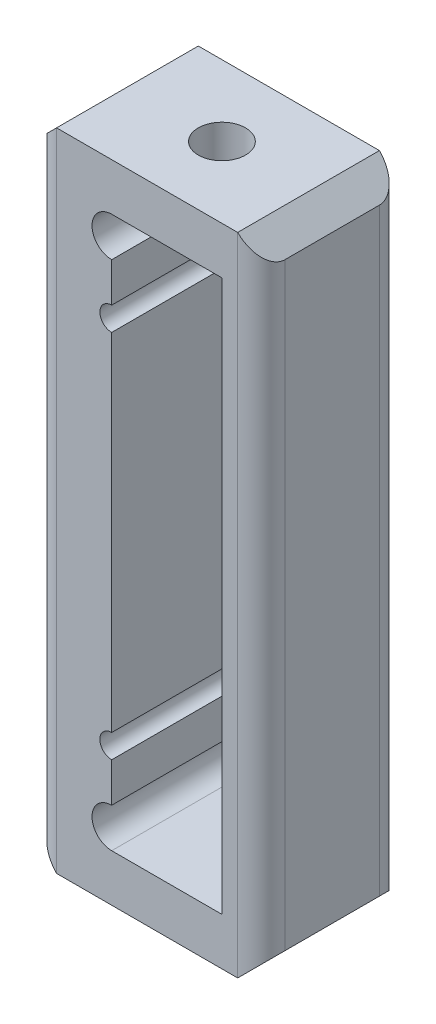
ISO-10303-21;
HEADER;
FILE_DESCRIPTION(('STEP AP214'),'2;1');
FILE_NAME('part.step','',(''),(''),'','','');
FILE_SCHEMA(('AUTOMOTIVE_DESIGN { 1 0 10303 214 1 1 1 1 }'));
ENDSEC;
DATA;
#1=APPLICATION_CONTEXT('core data for automotive mechanical design processes');
#2=APPLICATION_PROTOCOL_DEFINITION('international standard','automotive_design',2000,#1);
#3=PRODUCT_CONTEXT('',#1,'mechanical');
#4=PRODUCT('Part','Part','',(#3));
#5=PRODUCT_RELATED_PRODUCT_CATEGORY('part','',(#4));
#6=PRODUCT_DEFINITION_FORMATION('','',#4);
#7=PRODUCT_DEFINITION_CONTEXT('part definition',#1,'design');
#8=PRODUCT_DEFINITION('design','',#6,#7);
#9=PRODUCT_DEFINITION_SHAPE('','',#8);
#10=(LENGTH_UNIT() NAMED_UNIT(*) SI_UNIT(.MILLI.,.METRE.));
#11=(NAMED_UNIT(*) PLANE_ANGLE_UNIT() SI_UNIT($,.RADIAN.));
#12=(NAMED_UNIT(*) SI_UNIT($,.STERADIAN.) SOLID_ANGLE_UNIT());
#13=UNCERTAINTY_MEASURE_WITH_UNIT(LENGTH_MEASURE(1.E-05),#10,'distance_accuracy_value','');
#14=(GEOMETRIC_REPRESENTATION_CONTEXT(3) GLOBAL_UNCERTAINTY_ASSIGNED_CONTEXT((#13)) GLOBAL_UNIT_ASSIGNED_CONTEXT((#10,
#11,#12)) REPRESENTATION_CONTEXT('',''));
#15=CARTESIAN_POINT('',(0.,0.,0.));
#16=DIRECTION('',(0.,0.,1.));
#17=DIRECTION('',(1.,0.,0.));
#18=AXIS2_PLACEMENT_3D('',#15,#16,#17);
#19=CARTESIAN_POINT('',(0.,0.,18.));
#20=DIRECTION('',(0.,0.,-1.));
#21=DIRECTION('',(-1.,0.,0.));
#22=AXIS2_PLACEMENT_3D('',#19,#20,#21);
#23=PLANE('',#22);
#24=DIRECTION('',(-1.,0.,0.));
#25=VECTOR('',#24,1.);
#26=CARTESIAN_POINT('',(-27.5050761443207,11.3246141043772,18.));
#27=LINE('',#26,#25);
#28=CARTESIAN_POINT('',(-1.50507614432065,11.3246141043772,18.));
#29=VERTEX_POINT('',#28);
#30=CARTESIAN_POINT('',(-24.5050761443206,11.3246141043772,18.));
#31=VERTEX_POINT('',#30);
#32=EDGE_CURVE('E245',#29,#31,#27,.T.);
#33=ORIENTED_EDGE('',*,*,#32,.T.);
#34=DIRECTION('',(0.,-1.,0.));
#35=VECTOR('',#34,1.);
#36=CARTESIAN_POINT('',(-24.5050761443207,0.,18.));
#37=LINE('',#36,#35);
#38=CARTESIAN_POINT('',(-24.5050761443207,-70.6753858956228,18.));
#39=VERTEX_POINT('',#38);
#40=EDGE_CURVE('E298',#31,#39,#37,.T.);
#41=ORIENTED_EDGE('',*,*,#40,.T.);
#42=DIRECTION('',(1.,0.,0.));
#43=VECTOR('',#42,1.);
#44=CARTESIAN_POINT('',(-27.5050761443207,-70.6753858956228,18.));
#45=LINE('',#44,#43);
#46=CARTESIAN_POINT('',(-1.50507614432069,-70.6753858956228,18.));
#47=VERTEX_POINT('',#46);
#48=EDGE_CURVE('E248',#39,#47,#45,.T.);
#49=ORIENTED_EDGE('',*,*,#48,.T.);
#50=DIRECTION('',(0.,1.,0.));
#51=VECTOR('',#50,1.);
#52=CARTESIAN_POINT('',(-1.50507614432066,0.,18.));
#53=LINE('',#52,#51);
#54=EDGE_CURVE('E295',#47,#29,#53,.T.);
#55=ORIENTED_EDGE('',*,*,#54,.T.);
#56=EDGE_LOOP('',(#33,#41,#49,#55));
#57=FACE_BOUND('',#56,.T.);
#58=CARTESIAN_POINT('',(-17.5050761443207,2.82461410437722,18.));
#59=DIRECTION('',(0.,0.,1.));
#60=DIRECTION('',(1.,0.,0.));
#61=AXIS2_PLACEMENT_3D('',#58,#59,#60);
#62=CIRCLE('',#61,2.5);
#63=CARTESIAN_POINT('',(-17.5050761443207,5.32461410437722,18.));
#64=VERTEX_POINT('',#63);
#65=CARTESIAN_POINT('',(-17.5050761443207,0.324614104377219,18.));
#66=VERTEX_POINT('',#65);
#67=EDGE_CURVE('E159',#64,#66,#62,.T.);
#68=ORIENTED_EDGE('',*,*,#67,.F.);
#69=DIRECTION('',(-1.,0.,0.));
#70=VECTOR('',#69,1.);
#71=CARTESIAN_POINT('',(-17.5050761443207,5.32461410437722,18.));
#72=LINE('',#71,#70);
#73=CARTESIAN_POINT('',(-3.50507614432066,5.32461410437722,18.));
#74=VERTEX_POINT('',#73);
#75=EDGE_CURVE('E200',#74,#64,#72,.T.);
#76=ORIENTED_EDGE('',*,*,#75,.F.);
#77=DIRECTION('',(0.,1.,0.));
#78=VECTOR('',#77,1.);
#79=CARTESIAN_POINT('',(-3.50507614432066,5.32461410437722,18.));
#80=LINE('',#79,#78);
#81=CARTESIAN_POINT('',(-3.50507614432066,-64.6753858956228,18.));
#82=VERTEX_POINT('',#81);
#83=EDGE_CURVE('E197',#82,#74,#80,.T.);
#84=ORIENTED_EDGE('',*,*,#83,.F.);
#85=DIRECTION('',(1.,0.,0.));
#86=VECTOR('',#85,1.);
#87=CARTESIAN_POINT('',(-17.5050761443207,-64.6753858956228,18.));
#88=LINE('',#87,#86);
#89=CARTESIAN_POINT('',(-17.5050761443207,-64.6753858956228,18.));
#90=VERTEX_POINT('',#89);
#91=EDGE_CURVE('E195',#90,#82,#88,.T.);
#92=ORIENTED_EDGE('',*,*,#91,.F.);
#93=CARTESIAN_POINT('',(-17.5050761443207,-62.1753858956228,18.));
#94=DIRECTION('',(0.,0.,1.));
#95=DIRECTION('',(1.,0.,0.));
#96=AXIS2_PLACEMENT_3D('',#93,#94,#95);
#97=CIRCLE('',#96,2.5);
#98=CARTESIAN_POINT('',(-17.5050761443207,-59.6753858956228,18.));
#99=VERTEX_POINT('',#98);
#100=EDGE_CURVE('E193',#99,#90,#97,.T.);
#101=ORIENTED_EDGE('',*,*,#100,.F.);
#102=DIRECTION('',(0.,-1.,0.));
#103=VECTOR('',#102,1.);
#104=CARTESIAN_POINT('',(-17.5050761443207,-54.6753858956228,18.));
#105=LINE('',#104,#103);
#106=CARTESIAN_POINT('',(-17.5050761443207,-54.6753858956228,18.));
#107=VERTEX_POINT('',#106);
#108=EDGE_CURVE('E191',#107,#99,#105,.T.);
#109=ORIENTED_EDGE('',*,*,#108,.F.);
#110=CARTESIAN_POINT('',(-17.5050761443207,-53.1753858956228,18.));
#111=DIRECTION('',(0.,0.,1.));
#112=DIRECTION('',(1.,0.,0.));
#113=AXIS2_PLACEMENT_3D('',#110,#111,#112);
#114=CIRCLE('',#113,1.5);
#115=CARTESIAN_POINT('',(-17.5050761443207,-51.6753858956228,18.));
#116=VERTEX_POINT('',#115);
#117=EDGE_CURVE('E189',#116,#107,#114,.T.);
#118=ORIENTED_EDGE('',*,*,#117,.F.);
#119=DIRECTION('',(0.,-1.,0.));
#120=VECTOR('',#119,1.);
#121=CARTESIAN_POINT('',(-17.5050761443207,-7.67538589562279,18.));
#122=LINE('',#121,#120);
#123=CARTESIAN_POINT('',(-17.5050761443207,-7.67538589562279,18.));
#124=VERTEX_POINT('',#123);
#125=EDGE_CURVE('E184',#124,#116,#122,.T.);
#126=ORIENTED_EDGE('',*,*,#125,.F.);
#127=CARTESIAN_POINT('',(-17.5050761443207,-6.17538589562278,18.));
#128=DIRECTION('',(0.,0.,1.));
#129=DIRECTION('',(1.,0.,0.));
#130=AXIS2_PLACEMENT_3D('',#127,#128,#129);
#131=CIRCLE('',#130,1.5);
#132=CARTESIAN_POINT('',(-17.5050761443207,-4.67538589562278,18.));
#133=VERTEX_POINT('',#132);
#134=EDGE_CURVE('E182',#133,#124,#131,.T.);
#135=ORIENTED_EDGE('',*,*,#134,.F.);
#136=DIRECTION('',(0.,-1.,0.));
#137=VECTOR('',#136,1.);
#138=CARTESIAN_POINT('',(-17.5050761443207,0.324614104377219,18.));
#139=LINE('',#138,#137);
#140=EDGE_CURVE('E169',#66,#133,#139,.T.);
#141=ORIENTED_EDGE('',*,*,#140,.F.);
#142=EDGE_LOOP('',(#68,#76,#84,#92,#101,#109,#118,#126,#135,#141));
#143=FACE_BOUND('',#142,.T.);
#144=ADVANCED_FACE('F33',(#57,#143),#23,.F.);
#145=CARTESIAN_POINT('',(0.,0.,0.));
#146=DIRECTION('',(0.,0.,-1.));
#147=DIRECTION('',(-1.,0.,0.));
#148=AXIS2_PLACEMENT_3D('',#145,#146,#147);
#149=PLANE('',#148);
#150=DIRECTION('',(1.,0.,0.));
#151=VECTOR('',#150,1.);
#152=CARTESIAN_POINT('',(-27.5050761443207,-70.6753858956228,0.));
#153=LINE('',#152,#151);
#154=CARTESIAN_POINT('',(-24.5050761443207,-70.6753858956228,0.));
#155=VERTEX_POINT('',#154);
#156=CARTESIAN_POINT('',(-1.50507614432069,-70.6753858956228,0.));
#157=VERTEX_POINT('',#156);
#158=EDGE_CURVE('E249',#155,#157,#153,.T.);
#159=ORIENTED_EDGE('',*,*,#158,.F.);
#160=DIRECTION('',(0.,-1.,0.));
#161=VECTOR('',#160,1.);
#162=CARTESIAN_POINT('',(-24.5050761443207,8.32461410437722,0.));
#163=LINE('',#162,#161);
#164=CARTESIAN_POINT('',(-24.5050761443206,11.3246141043772,0.));
#165=VERTEX_POINT('',#164);
#166=EDGE_CURVE('E289',#155,#165,#163,.F.);
#167=ORIENTED_EDGE('',*,*,#166,.T.);
#168=DIRECTION('',(-1.,0.,0.));
#169=VECTOR('',#168,1.);
#170=CARTESIAN_POINT('',(-27.5050761443207,11.3246141043772,0.));
#171=LINE('',#170,#169);
#172=CARTESIAN_POINT('',(-1.50507614432065,11.3246141043772,0.));
#173=VERTEX_POINT('',#172);
#174=EDGE_CURVE('E177',#173,#165,#171,.T.);
#175=ORIENTED_EDGE('',*,*,#174,.F.);
#176=DIRECTION('',(0.,1.,0.));
#177=VECTOR('',#176,1.);
#178=CARTESIAN_POINT('',(-1.50507614432066,-67.6753858956228,0.));
#179=LINE('',#178,#177);
#180=EDGE_CURVE('E287',#173,#157,#179,.F.);
#181=ORIENTED_EDGE('',*,*,#180,.T.);
#182=EDGE_LOOP('',(#159,#167,#175,#181));
#183=FACE_BOUND('',#182,.T.);
#184=DIRECTION('',(-1.,0.,0.));
#185=VECTOR('',#184,1.);
#186=CARTESIAN_POINT('',(-17.5050761443207,5.32461410437722,0.));
#187=LINE('',#186,#185);
#188=CARTESIAN_POINT('',(-3.50507614432066,5.32461410437722,0.));
#189=VERTEX_POINT('',#188);
#190=CARTESIAN_POINT('',(-17.5050761443207,5.32461410437722,0.));
#191=VERTEX_POINT('',#190);
#192=EDGE_CURVE('E170',#189,#191,#187,.T.);
#193=ORIENTED_EDGE('',*,*,#192,.T.);
#194=CARTESIAN_POINT('',(-17.5050761443207,2.82461410437722,0.));
#195=DIRECTION('',(0.,0.,1.));
#196=DIRECTION('',(1.,0.,0.));
#197=AXIS2_PLACEMENT_3D('',#194,#195,#196);
#198=CIRCLE('',#197,2.5);
#199=CARTESIAN_POINT('',(-17.5050761443207,0.324614104377219,0.));
#200=VERTEX_POINT('',#199);
#201=EDGE_CURVE('E202',#191,#200,#198,.T.);
#202=ORIENTED_EDGE('',*,*,#201,.T.);
#203=DIRECTION('',(0.,-1.,0.));
#204=VECTOR('',#203,1.);
#205=CARTESIAN_POINT('',(-17.5050761443207,0.324614104377219,0.));
#206=LINE('',#205,#204);
#207=CARTESIAN_POINT('',(-17.5050761443207,-4.67538589562278,0.));
#208=VERTEX_POINT('',#207);
#209=EDGE_CURVE('E176',#200,#208,#206,.T.);
#210=ORIENTED_EDGE('',*,*,#209,.T.);
#211=CARTESIAN_POINT('',(-17.5050761443207,-6.17538589562278,0.));
#212=DIRECTION('',(0.,0.,1.));
#213=DIRECTION('',(1.,0.,0.));
#214=AXIS2_PLACEMENT_3D('',#211,#212,#213);
#215=CIRCLE('',#214,1.5);
#216=CARTESIAN_POINT('',(-17.5050761443207,-7.67538589562279,0.));
#217=VERTEX_POINT('',#216);
#218=EDGE_CURVE('E206',#208,#217,#215,.T.);
#219=ORIENTED_EDGE('',*,*,#218,.T.);
#220=DIRECTION('',(0.,-1.,0.));
#221=VECTOR('',#220,1.);
#222=CARTESIAN_POINT('',(-17.5050761443207,-7.67538589562279,0.));
#223=LINE('',#222,#221);
#224=CARTESIAN_POINT('',(-17.5050761443207,-51.6753858956228,0.));
#225=VERTEX_POINT('',#224);
#226=EDGE_CURVE('E209',#217,#225,#223,.T.);
#227=ORIENTED_EDGE('',*,*,#226,.T.);
#228=CARTESIAN_POINT('',(-17.5050761443207,-53.1753858956228,0.));
#229=DIRECTION('',(0.,0.,1.));
#230=DIRECTION('',(1.,0.,0.));
#231=AXIS2_PLACEMENT_3D('',#228,#229,#230);
#232=CIRCLE('',#231,1.5);
#233=CARTESIAN_POINT('',(-17.5050761443207,-54.6753858956228,0.));
#234=VERTEX_POINT('',#233);
#235=EDGE_CURVE('E212',#225,#234,#232,.T.);
#236=ORIENTED_EDGE('',*,*,#235,.T.);
#237=DIRECTION('',(0.,-1.,0.));
#238=VECTOR('',#237,1.);
#239=CARTESIAN_POINT('',(-17.5050761443207,-54.6753858956228,0.));
#240=LINE('',#239,#238);
#241=CARTESIAN_POINT('',(-17.5050761443207,-59.6753858956228,0.));
#242=VERTEX_POINT('',#241);
#243=EDGE_CURVE('E215',#234,#242,#240,.T.);
#244=ORIENTED_EDGE('',*,*,#243,.T.);
#245=CARTESIAN_POINT('',(-17.5050761443207,-62.1753858956228,0.));
#246=DIRECTION('',(0.,0.,1.));
#247=DIRECTION('',(1.,0.,0.));
#248=AXIS2_PLACEMENT_3D('',#245,#246,#247);
#249=CIRCLE('',#248,2.5);
#250=CARTESIAN_POINT('',(-17.5050761443207,-64.6753858956228,0.));
#251=VERTEX_POINT('',#250);
#252=EDGE_CURVE('E218',#242,#251,#249,.T.);
#253=ORIENTED_EDGE('',*,*,#252,.T.);
#254=DIRECTION('',(1.,0.,0.));
#255=VECTOR('',#254,1.);
#256=CARTESIAN_POINT('',(-17.5050761443207,-64.6753858956228,0.));
#257=LINE('',#256,#255);
#258=CARTESIAN_POINT('',(-3.50507614432066,-64.6753858956228,0.));
#259=VERTEX_POINT('',#258);
#260=EDGE_CURVE('E221',#251,#259,#257,.T.);
#261=ORIENTED_EDGE('',*,*,#260,.T.);
#262=DIRECTION('',(0.,1.,0.));
#263=VECTOR('',#262,1.);
#264=CARTESIAN_POINT('',(-3.50507614432066,5.32461410437722,0.));
#265=LINE('',#264,#263);
#266=EDGE_CURVE('E224',#259,#189,#265,.T.);
#267=ORIENTED_EDGE('',*,*,#266,.T.);
#268=EDGE_LOOP('',(#193,#202,#210,#219,#227,#236,#244,#253,#261,#267));
#269=FACE_BOUND('',#268,.T.);
#270=ADVANCED_FACE('F334',(#183,#269),#149,.T.);
#271=CARTESIAN_POINT('',(-27.5050761443207,11.3246141043772,18.));
#272=DIRECTION('',(0.,-1.,0.));
#273=DIRECTION('',(0.,0.,-1.));
#274=AXIS2_PLACEMENT_3D('',#271,#272,#273);
#275=PLANE('',#274);
#276=CARTESIAN_POINT('',(-12.5050761443206,11.3246141043772,9.));
#277=DIRECTION('',(0.,1.,0.));
#278=DIRECTION('',(0.,0.,1.));
#279=AXIS2_PLACEMENT_3D('',#276,#277,#278);
#280=CIRCLE('',#279,3.);
#281=CARTESIAN_POINT('',(-12.5050761443206,11.3246141043772,12.));
#282=VERTEX_POINT('',#281);
#283=EDGE_CURVE('E605',#282,#282,#280,.T.);
#284=ORIENTED_EDGE('',*,*,#283,.F.);
#285=EDGE_LOOP('',(#284));
#286=FACE_BOUND('',#285,.T.);
#287=ORIENTED_EDGE('',*,*,#32,.F.);
#288=DIRECTION('',(0.,0.,-1.));
#289=VECTOR('',#288,1.);
#290=CARTESIAN_POINT('',(-1.50507614432066,11.3246141043772,18.));
#291=LINE('',#290,#289);
#292=EDGE_CURVE('E259',#29,#173,#291,.T.);
#293=ORIENTED_EDGE('',*,*,#292,.T.);
#294=ORIENTED_EDGE('',*,*,#174,.T.);
#295=DIRECTION('',(0.,0.,1.));
#296=VECTOR('',#295,1.);
#297=CARTESIAN_POINT('',(-24.5050761443206,11.3246141043772,18.));
#298=LINE('',#297,#296);
#299=EDGE_CURVE('E252',#165,#31,#298,.T.);
#300=ORIENTED_EDGE('',*,*,#299,.T.);
#301=EDGE_LOOP('',(#287,#293,#294,#300));
#302=FACE_BOUND('',#301,.T.);
#303=ADVANCED_FACE('F331',(#286,#302),#275,.F.);
#304=CARTESIAN_POINT('',(-27.5050761443207,11.3246141043772,18.));
#305=DIRECTION('',(1.,0.,0.));
#306=DIRECTION('',(0.,0.,-1.));
#307=AXIS2_PLACEMENT_3D('',#304,#305,#306);
#308=PLANE('',#307);
#309=DIRECTION('',(0.,0.,-1.));
#310=VECTOR('',#309,1.);
#311=CARTESIAN_POINT('',(-27.5050761443207,8.32461410437722,18.));
#312=LINE('',#311,#310);
#313=CARTESIAN_POINT('',(-27.5050761443207,8.32461410437722,15.));
#314=VERTEX_POINT('',#313);
#315=CARTESIAN_POINT('',(-27.5050761443207,8.32461410437722,3.));
#316=VERTEX_POINT('',#315);
#317=EDGE_CURVE('E269',#314,#316,#312,.T.);
#318=ORIENTED_EDGE('',*,*,#317,.T.);
#319=DIRECTION('',(0.,-1.,0.));
#320=VECTOR('',#319,1.);
#321=CARTESIAN_POINT('',(-27.5050761443207,-67.6753858956228,3.));
#322=LINE('',#321,#320);
#323=CARTESIAN_POINT('',(-27.5050761443207,-67.6753858956228,3.));
#324=VERTEX_POINT('',#323);
#325=EDGE_CURVE('E280',#316,#324,#322,.T.);
#326=ORIENTED_EDGE('',*,*,#325,.T.);
#327=DIRECTION('',(0.,0.,1.));
#328=VECTOR('',#327,1.);
#329=CARTESIAN_POINT('',(-27.5050761443207,-67.6753858956228,18.));
#330=LINE('',#329,#328);
#331=CARTESIAN_POINT('',(-27.5050761443207,-67.6753858956228,15.));
#332=VERTEX_POINT('',#331);
#333=EDGE_CURVE('E266',#324,#332,#330,.T.);
#334=ORIENTED_EDGE('',*,*,#333,.T.);
#335=DIRECTION('',(0.,-1.,0.));
#336=VECTOR('',#335,1.);
#337=CARTESIAN_POINT('',(-27.5050761443207,11.3246141043772,15.));
#338=LINE('',#337,#336);
#339=EDGE_CURVE('E278',#332,#314,#338,.F.);
#340=ORIENTED_EDGE('',*,*,#339,.T.);
#341=EDGE_LOOP('',(#318,#326,#334,#340));
#342=FACE_BOUND('',#341,.T.);
#343=ADVANCED_FACE('F346',(#342),#308,.F.);
#344=CARTESIAN_POINT('',(-27.5050761443207,-70.6753858956228,18.));
#345=DIRECTION('',(0.,1.,0.));
#346=DIRECTION('',(0.,0.,1.));
#347=AXIS2_PLACEMENT_3D('',#344,#345,#346);
#348=PLANE('',#347);
#349=CARTESIAN_POINT('',(-12.5050761443207,-70.6753858956228,9.));
#350=DIRECTION('',(0.,-1.,0.));
#351=DIRECTION('',(0.,0.,-1.));
#352=AXIS2_PLACEMENT_3D('',#349,#350,#351);
#353=CIRCLE('',#352,3.);
#354=CARTESIAN_POINT('',(-12.5050761443207,-70.6753858956228,6.));
#355=VERTEX_POINT('',#354);
#356=EDGE_CURVE('E604',#355,#355,#353,.T.);
#357=ORIENTED_EDGE('',*,*,#356,.F.);
#358=EDGE_LOOP('',(#357));
#359=FACE_BOUND('',#358,.T.);
#360=ORIENTED_EDGE('',*,*,#48,.F.);
#361=DIRECTION('',(0.,0.,-1.));
#362=VECTOR('',#361,1.);
#363=CARTESIAN_POINT('',(-24.5050761443207,-70.6753858956228,18.));
#364=LINE('',#363,#362);
#365=EDGE_CURVE('E275',#39,#155,#364,.T.);
#366=ORIENTED_EDGE('',*,*,#365,.T.);
#367=ORIENTED_EDGE('',*,*,#158,.T.);
#368=DIRECTION('',(0.,0.,1.));
#369=VECTOR('',#368,1.);
#370=CARTESIAN_POINT('',(-1.50507614432069,-70.6753858956228,18.));
#371=LINE('',#370,#369);
#372=EDGE_CURVE('E272',#157,#47,#371,.T.);
#373=ORIENTED_EDGE('',*,*,#372,.T.);
#374=EDGE_LOOP('',(#360,#366,#367,#373));
#375=FACE_BOUND('',#374,.T.);
#376=ADVANCED_FACE('F314',(#359,#375),#348,.F.);
#377=CARTESIAN_POINT('',(1.49492385567935,11.3246141043772,18.));
#378=DIRECTION('',(-1.,0.,0.));
#379=DIRECTION('',(0.,-1.,0.));
#380=AXIS2_PLACEMENT_3D('',#377,#378,#379);
#381=PLANE('',#380);
#382=DIRECTION('',(0.,0.,-1.));
#383=VECTOR('',#382,1.);
#384=CARTESIAN_POINT('',(1.49492385567934,-67.6753858956228,18.));
#385=LINE('',#384,#383);
#386=CARTESIAN_POINT('',(1.49492385567934,-67.6753858956228,15.));
#387=VERTEX_POINT('',#386);
#388=CARTESIAN_POINT('',(1.49492385567934,-67.6753858956228,3.));
#389=VERTEX_POINT('',#388);
#390=EDGE_CURVE('E262',#387,#389,#385,.T.);
#391=ORIENTED_EDGE('',*,*,#390,.T.);
#392=DIRECTION('',(0.,1.,0.));
#393=VECTOR('',#392,1.);
#394=CARTESIAN_POINT('',(1.49492385567935,8.32461410437721,3.));
#395=LINE('',#394,#393);
#396=CARTESIAN_POINT('',(1.49492385567935,8.32461410437721,3.));
#397=VERTEX_POINT('',#396);
#398=EDGE_CURVE('E302',#389,#397,#395,.T.);
#399=ORIENTED_EDGE('',*,*,#398,.T.);
#400=DIRECTION('',(0.,0.,1.));
#401=VECTOR('',#400,1.);
#402=CARTESIAN_POINT('',(1.49492385567935,8.32461410437721,18.));
#403=LINE('',#402,#401);
#404=CARTESIAN_POINT('',(1.49492385567935,8.32461410437721,15.));
#405=VERTEX_POINT('',#404);
#406=EDGE_CURVE('E264',#397,#405,#403,.T.);
#407=ORIENTED_EDGE('',*,*,#406,.T.);
#408=DIRECTION('',(0.,1.,0.));
#409=VECTOR('',#408,1.);
#410=CARTESIAN_POINT('',(1.49492385567935,11.3246141043772,15.));
#411=LINE('',#410,#409);
#412=EDGE_CURVE('E53',#405,#387,#411,.F.);
#413=ORIENTED_EDGE('',*,*,#412,.T.);
#414=EDGE_LOOP('',(#391,#399,#407,#413));
#415=FACE_BOUND('',#414,.T.);
#416=ADVANCED_FACE('F324',(#415),#381,.F.);
#417=CARTESIAN_POINT('',(-17.5050761443207,2.82461410437722,18.));
#418=DIRECTION('',(0.,0.,-1.));
#419=DIRECTION('',(-1.,0.,0.));
#420=AXIS2_PLACEMENT_3D('',#417,#418,#419);
#421=CYLINDRICAL_SURFACE('',#420,2.5);
#422=ORIENTED_EDGE('',*,*,#201,.F.);
#423=DIRECTION('',(0.,0.,-1.));
#424=VECTOR('',#423,1.);
#425=CARTESIAN_POINT('',(-17.5050761443207,5.32461410437722,18.));
#426=LINE('',#425,#424);
#427=EDGE_CURVE('E165',#64,#191,#426,.T.);
#428=ORIENTED_EDGE('',*,*,#427,.F.);
#429=ORIENTED_EDGE('',*,*,#67,.T.);
#430=DIRECTION('',(0.,0.,-1.));
#431=VECTOR('',#430,1.);
#432=CARTESIAN_POINT('',(-17.5050761443207,0.324614104377219,18.));
#433=LINE('',#432,#431);
#434=EDGE_CURVE('E162',#66,#200,#433,.T.);
#435=ORIENTED_EDGE('',*,*,#434,.T.);
#436=EDGE_LOOP('',(#422,#428,#429,#435));
#437=FACE_BOUND('',#436,.T.);
#438=ADVANCED_FACE('F161',(#437),#421,.F.);
#439=CARTESIAN_POINT('',(-17.5050761443207,0.324614104377219,18.));
#440=DIRECTION('',(1.,0.,0.));
#441=DIRECTION('',(0.,0.,-1.));
#442=AXIS2_PLACEMENT_3D('',#439,#440,#441);
#443=PLANE('',#442);
#444=ORIENTED_EDGE('',*,*,#209,.F.);
#445=ORIENTED_EDGE('',*,*,#434,.F.);
#446=ORIENTED_EDGE('',*,*,#140,.T.);
#447=DIRECTION('',(0.,0.,-1.));
#448=VECTOR('',#447,1.);
#449=CARTESIAN_POINT('',(-17.5050761443207,-4.67538589562278,18.));
#450=LINE('',#449,#448);
#451=EDGE_CURVE('E178',#133,#208,#450,.T.);
#452=ORIENTED_EDGE('',*,*,#451,.T.);
#453=EDGE_LOOP('',(#444,#445,#446,#452));
#454=FACE_BOUND('',#453,.T.);
#455=ADVANCED_FACE('F173',(#454),#443,.T.);
#456=CARTESIAN_POINT('',(-17.5050761443207,-6.17538589562278,18.));
#457=DIRECTION('',(0.,0.,-1.));
#458=DIRECTION('',(-1.,0.,0.));
#459=AXIS2_PLACEMENT_3D('',#456,#457,#458);
#460=CYLINDRICAL_SURFACE('',#459,1.5);
#461=ORIENTED_EDGE('',*,*,#218,.F.);
#462=ORIENTED_EDGE('',*,*,#451,.F.);
#463=ORIENTED_EDGE('',*,*,#134,.T.);
#464=DIRECTION('',(0.,0.,-1.));
#465=VECTOR('',#464,1.);
#466=CARTESIAN_POINT('',(-17.5050761443207,-7.67538589562279,18.));
#467=LINE('',#466,#465);
#468=EDGE_CURVE('E242',#124,#217,#467,.T.);
#469=ORIENTED_EDGE('',*,*,#468,.T.);
#470=EDGE_LOOP('',(#461,#462,#463,#469));
#471=FACE_BOUND('',#470,.T.);
#472=ADVANCED_FACE('F417',(#471),#460,.F.);
#473=CARTESIAN_POINT('',(-17.5050761443207,-7.67538589562279,18.));
#474=DIRECTION('',(1.,0.,0.));
#475=DIRECTION('',(0.,0.,-1.));
#476=AXIS2_PLACEMENT_3D('',#473,#474,#475);
#477=PLANE('',#476);
#478=ORIENTED_EDGE('',*,*,#226,.F.);
#479=ORIENTED_EDGE('',*,*,#468,.F.);
#480=ORIENTED_EDGE('',*,*,#125,.T.);
#481=DIRECTION('',(0.,0.,-1.));
#482=VECTOR('',#481,1.);
#483=CARTESIAN_POINT('',(-17.5050761443207,-51.6753858956228,18.));
#484=LINE('',#483,#482);
#485=EDGE_CURVE('E240',#116,#225,#484,.T.);
#486=ORIENTED_EDGE('',*,*,#485,.T.);
#487=EDGE_LOOP('',(#478,#479,#480,#486));
#488=FACE_BOUND('',#487,.T.);
#489=ADVANCED_FACE('F413',(#488),#477,.T.);
#490=CARTESIAN_POINT('',(-17.5050761443207,-53.1753858956228,18.));
#491=DIRECTION('',(0.,0.,-1.));
#492=DIRECTION('',(-1.,0.,0.));
#493=AXIS2_PLACEMENT_3D('',#490,#491,#492);
#494=CYLINDRICAL_SURFACE('',#493,1.5);
#495=ORIENTED_EDGE('',*,*,#235,.F.);
#496=ORIENTED_EDGE('',*,*,#485,.F.);
#497=ORIENTED_EDGE('',*,*,#117,.T.);
#498=DIRECTION('',(0.,0.,-1.));
#499=VECTOR('',#498,1.);
#500=CARTESIAN_POINT('',(-17.5050761443207,-54.6753858956228,18.));
#501=LINE('',#500,#499);
#502=EDGE_CURVE('E238',#107,#234,#501,.T.);
#503=ORIENTED_EDGE('',*,*,#502,.T.);
#504=EDGE_LOOP('',(#495,#496,#497,#503));
#505=FACE_BOUND('',#504,.T.);
#506=ADVANCED_FACE('F409',(#505),#494,.F.);
#507=CARTESIAN_POINT('',(-17.5050761443207,-54.6753858956228,18.));
#508=DIRECTION('',(1.,0.,0.));
#509=DIRECTION('',(0.,0.,-1.));
#510=AXIS2_PLACEMENT_3D('',#507,#508,#509);
#511=PLANE('',#510);
#512=ORIENTED_EDGE('',*,*,#243,.F.);
#513=ORIENTED_EDGE('',*,*,#502,.F.);
#514=ORIENTED_EDGE('',*,*,#108,.T.);
#515=DIRECTION('',(0.,0.,-1.));
#516=VECTOR('',#515,1.);
#517=CARTESIAN_POINT('',(-17.5050761443207,-59.6753858956228,18.));
#518=LINE('',#517,#516);
#519=EDGE_CURVE('E236',#99,#242,#518,.T.);
#520=ORIENTED_EDGE('',*,*,#519,.T.);
#521=EDGE_LOOP('',(#512,#513,#514,#520));
#522=FACE_BOUND('',#521,.T.);
#523=ADVANCED_FACE('F405',(#522),#511,.T.);
#524=CARTESIAN_POINT('',(-17.5050761443207,-62.1753858956228,18.));
#525=DIRECTION('',(0.,0.,-1.));
#526=DIRECTION('',(-1.,0.,0.));
#527=AXIS2_PLACEMENT_3D('',#524,#525,#526);
#528=CYLINDRICAL_SURFACE('',#527,2.5);
#529=ORIENTED_EDGE('',*,*,#252,.F.);
#530=ORIENTED_EDGE('',*,*,#519,.F.);
#531=ORIENTED_EDGE('',*,*,#100,.T.);
#532=DIRECTION('',(0.,0.,-1.));
#533=VECTOR('',#532,1.);
#534=CARTESIAN_POINT('',(-17.5050761443207,-64.6753858956228,18.));
#535=LINE('',#534,#533);
#536=EDGE_CURVE('E234',#90,#251,#535,.T.);
#537=ORIENTED_EDGE('',*,*,#536,.T.);
#538=EDGE_LOOP('',(#529,#530,#531,#537));
#539=FACE_BOUND('',#538,.T.);
#540=ADVANCED_FACE('F401',(#539),#528,.F.);
#541=CARTESIAN_POINT('',(-17.5050761443207,-64.6753858956228,18.));
#542=DIRECTION('',(0.,1.,0.));
#543=DIRECTION('',(0.,0.,1.));
#544=AXIS2_PLACEMENT_3D('',#541,#542,#543);
#545=PLANE('',#544);
#546=ORIENTED_EDGE('',*,*,#260,.F.);
#547=ORIENTED_EDGE('',*,*,#536,.F.);
#548=ORIENTED_EDGE('',*,*,#91,.T.);
#549=DIRECTION('',(0.,0.,-1.));
#550=VECTOR('',#549,1.);
#551=CARTESIAN_POINT('',(-3.50507614432066,-64.6753858956228,18.));
#552=LINE('',#551,#550);
#553=EDGE_CURVE('E232',#82,#259,#552,.T.);
#554=ORIENTED_EDGE('',*,*,#553,.T.);
#555=EDGE_LOOP('',(#546,#547,#548,#554));
#556=FACE_BOUND('',#555,.T.);
#557=ADVANCED_FACE('F391',(#556),#545,.T.);
#558=CARTESIAN_POINT('',(-3.50507614432066,5.32461410437722,18.));
#559=DIRECTION('',(-1.,0.,0.));
#560=DIRECTION('',(0.,0.,1.));
#561=AXIS2_PLACEMENT_3D('',#558,#559,#560);
#562=PLANE('',#561);
#563=ORIENTED_EDGE('',*,*,#266,.F.);
#564=ORIENTED_EDGE('',*,*,#553,.F.);
#565=ORIENTED_EDGE('',*,*,#83,.T.);
#566=DIRECTION('',(0.,0.,-1.));
#567=VECTOR('',#566,1.);
#568=CARTESIAN_POINT('',(-3.50507614432066,5.32461410437722,18.));
#569=LINE('',#568,#567);
#570=EDGE_CURVE('E230',#74,#189,#569,.T.);
#571=ORIENTED_EDGE('',*,*,#570,.T.);
#572=EDGE_LOOP('',(#563,#564,#565,#571));
#573=FACE_BOUND('',#572,.T.);
#574=ADVANCED_FACE('F385',(#573),#562,.T.);
#575=CARTESIAN_POINT('',(-17.5050761443207,5.32461410437722,18.));
#576=DIRECTION('',(0.,-1.,0.));
#577=DIRECTION('',(0.,0.,-1.));
#578=AXIS2_PLACEMENT_3D('',#575,#576,#577);
#579=PLANE('',#578);
#580=ORIENTED_EDGE('',*,*,#192,.F.);
#581=ORIENTED_EDGE('',*,*,#570,.F.);
#582=ORIENTED_EDGE('',*,*,#75,.T.);
#583=ORIENTED_EDGE('',*,*,#427,.T.);
#584=EDGE_LOOP('',(#580,#581,#582,#583));
#585=FACE_BOUND('',#584,.T.);
#586=ADVANCED_FACE('F381',(#585),#579,.T.);
#587=CARTESIAN_POINT('',(-1.50507614432066,11.3246141043772,18.));
#588=DIRECTION('',(-0.707106781186549,-0.707106781186546,0.));
#589=DIRECTION('',(0.,0.,-1.));
#590=AXIS2_PLACEMENT_3D('',#587,#588,#589);
#591=PLANE('',#590);
#592=ORIENTED_EDGE('',*,*,#406,.F.);
#593=CARTESIAN_POINT('',(-1.50507614432065,11.3246141043772,3.));
#594=DIRECTION('',(-0.707106781186549,-0.707106781186546,0.));
#595=DIRECTION('',(0.707106781186546,-0.707106781186549,0.));
#596=AXIS2_PLACEMENT_3D('',#593,#594,#595);
#597=ELLIPSE('',#596,4.2426406871193,3.);
#598=EDGE_CURVE('E307',#397,#173,#597,.F.);
#599=ORIENTED_EDGE('',*,*,#598,.T.);
#600=ORIENTED_EDGE('',*,*,#292,.F.);
#601=CARTESIAN_POINT('',(-1.50507614432065,11.3246141043772,15.));
#602=DIRECTION('',(-0.707106781186549,-0.707106781186546,0.));
#603=DIRECTION('',(-0.707106781186546,0.707106781186549,0.));
#604=AXIS2_PLACEMENT_3D('',#601,#602,#603);
#605=ELLIPSE('',#604,4.2426406871193,3.);
#606=EDGE_CURVE('E305',#29,#405,#605,.F.);
#607=ORIENTED_EDGE('',*,*,#606,.T.);
#608=EDGE_LOOP('',(#592,#599,#600,#607));
#609=FACE_BOUND('',#608,.T.);
#610=ADVANCED_FACE('F323',(#609),#591,.F.);
#611=CARTESIAN_POINT('',(-27.5050761443207,8.32461410437722,18.));
#612=DIRECTION('',(0.707106781186546,-0.707106781186549,0.));
#613=DIRECTION('',(0.,0.,-1.));
#614=AXIS2_PLACEMENT_3D('',#611,#612,#613);
#615=PLANE('',#614);
#616=ORIENTED_EDGE('',*,*,#299,.F.);
#617=CARTESIAN_POINT('',(-24.5050761443207,11.3246141043772,3.));
#618=DIRECTION('',(0.707106781186546,-0.707106781186549,0.));
#619=DIRECTION('',(0.707106781186549,0.707106781186546,0.));
#620=AXIS2_PLACEMENT_3D('',#617,#618,#619);
#621=ELLIPSE('',#620,4.24264068711928,3.);
#622=EDGE_CURVE('E293',#165,#316,#621,.F.);
#623=ORIENTED_EDGE('',*,*,#622,.T.);
#624=ORIENTED_EDGE('',*,*,#317,.F.);
#625=CARTESIAN_POINT('',(-24.5050761443207,11.3246141043772,15.));
#626=DIRECTION('',(0.707106781186546,-0.707106781186549,0.));
#627=DIRECTION('',(-0.707106781186549,-0.707106781186546,0.));
#628=AXIS2_PLACEMENT_3D('',#625,#626,#627);
#629=ELLIPSE('',#628,4.24264068711928,3.);
#630=EDGE_CURVE('E291',#314,#31,#629,.F.);
#631=ORIENTED_EDGE('',*,*,#630,.T.);
#632=EDGE_LOOP('',(#616,#623,#624,#631));
#633=FACE_BOUND('',#632,.T.);
#634=ADVANCED_FACE('F343',(#633),#615,.F.);
#635=CARTESIAN_POINT('',(-24.5050761443207,-70.6753858956228,18.));
#636=DIRECTION('',(0.707106781186551,0.707106781186544,0.));
#637=DIRECTION('',(0.,0.,-1.));
#638=AXIS2_PLACEMENT_3D('',#635,#636,#637);
#639=PLANE('',#638);
#640=ORIENTED_EDGE('',*,*,#333,.F.);
#641=CARTESIAN_POINT('',(-24.5050761443207,-70.6753858956228,3.));
#642=DIRECTION('',(0.707106781186551,0.707106781186544,0.));
#643=DIRECTION('',(-0.707106781186544,0.707106781186551,0.));
#644=AXIS2_PLACEMENT_3D('',#641,#642,#643);
#645=ELLIPSE('',#644,4.24264068711931,3.);
#646=EDGE_CURVE('E285',#324,#155,#645,.F.);
#647=ORIENTED_EDGE('',*,*,#646,.T.);
#648=ORIENTED_EDGE('',*,*,#365,.F.);
#649=CARTESIAN_POINT('',(-24.5050761443207,-70.6753858956228,15.));
#650=DIRECTION('',(0.707106781186551,0.707106781186544,0.));
#651=DIRECTION('',(0.707106781186544,-0.707106781186551,0.));
#652=AXIS2_PLACEMENT_3D('',#649,#650,#651);
#653=ELLIPSE('',#652,4.24264068711931,3.);
#654=EDGE_CURVE('E283',#39,#332,#653,.F.);
#655=ORIENTED_EDGE('',*,*,#654,.T.);
#656=EDGE_LOOP('',(#640,#647,#648,#655));
#657=FACE_BOUND('',#656,.T.);
#658=ADVANCED_FACE('F352',(#657),#639,.F.);
#659=CARTESIAN_POINT('',(1.49492385567934,-67.6753858956228,18.));
#660=DIRECTION('',(-0.707106781186546,0.707106781186549,0.));
#661=DIRECTION('',(0.,0.,-1.));
#662=AXIS2_PLACEMENT_3D('',#659,#660,#661);
#663=PLANE('',#662);
#664=ORIENTED_EDGE('',*,*,#372,.F.);
#665=CARTESIAN_POINT('',(-1.50507614432066,-70.6753858956227,3.));
#666=DIRECTION('',(-0.707106781186546,0.707106781186549,0.));
#667=DIRECTION('',(-0.707106781186549,-0.707106781186546,0.));
#668=AXIS2_PLACEMENT_3D('',#665,#666,#667);
#669=ELLIPSE('',#668,4.24264068711928,3.);
#670=EDGE_CURVE('E11',#157,#389,#669,.F.);
#671=ORIENTED_EDGE('',*,*,#670,.T.);
#672=ORIENTED_EDGE('',*,*,#390,.F.);
#673=CARTESIAN_POINT('',(-1.50507614432066,-70.6753858956227,15.));
#674=DIRECTION('',(-0.707106781186546,0.707106781186549,0.));
#675=DIRECTION('',(0.707106781186549,0.707106781186546,0.));
#676=AXIS2_PLACEMENT_3D('',#673,#674,#675);
#677=ELLIPSE('',#676,4.24264068711928,3.);
#678=EDGE_CURVE('E41',#387,#47,#677,.F.);
#679=ORIENTED_EDGE('',*,*,#678,.T.);
#680=EDGE_LOOP('',(#664,#671,#672,#679));
#681=FACE_BOUND('',#680,.T.);
#682=ADVANCED_FACE('F309',(#681),#663,.F.);
#683=CARTESIAN_POINT('',(-24.5050761443207,11.3246141043772,3.));
#684=DIRECTION('',(0.,1.,0.));
#685=DIRECTION('',(0.,0.,1.));
#686=AXIS2_PLACEMENT_3D('',#683,#684,#685);
#687=CYLINDRICAL_SURFACE('',#686,3.);
#688=ORIENTED_EDGE('',*,*,#622,.F.);
#689=ORIENTED_EDGE('',*,*,#166,.F.);
#690=ORIENTED_EDGE('',*,*,#646,.F.);
#691=ORIENTED_EDGE('',*,*,#325,.F.);
#692=EDGE_LOOP('',(#688,#689,#690,#691));
#693=FACE_BOUND('',#692,.T.);
#694=ADVANCED_FACE('F339',(#693),#687,.T.);
#695=CARTESIAN_POINT('',(-24.5050761443207,0.,15.));
#696=DIRECTION('',(0.,-1.,0.));
#697=DIRECTION('',(0.,0.,-1.));
#698=AXIS2_PLACEMENT_3D('',#695,#696,#697);
#699=CYLINDRICAL_SURFACE('',#698,3.);
#700=ORIENTED_EDGE('',*,*,#630,.F.);
#701=ORIENTED_EDGE('',*,*,#339,.F.);
#702=ORIENTED_EDGE('',*,*,#654,.F.);
#703=ORIENTED_EDGE('',*,*,#40,.F.);
#704=EDGE_LOOP('',(#700,#701,#702,#703));
#705=FACE_BOUND('',#704,.T.);
#706=ADVANCED_FACE('F350',(#705),#699,.T.);
#707=CARTESIAN_POINT('',(-1.50507614432065,11.3246141043772,3.));
#708=DIRECTION('',(0.,-1.,0.));
#709=DIRECTION('',(1.,0.,0.));
#710=AXIS2_PLACEMENT_3D('',#707,#708,#709);
#711=CYLINDRICAL_SURFACE('',#710,3.);
#712=ORIENTED_EDGE('',*,*,#670,.F.);
#713=ORIENTED_EDGE('',*,*,#180,.F.);
#714=ORIENTED_EDGE('',*,*,#598,.F.);
#715=ORIENTED_EDGE('',*,*,#398,.F.);
#716=EDGE_LOOP('',(#712,#713,#714,#715));
#717=FACE_BOUND('',#716,.T.);
#718=ADVANCED_FACE('F327',(#717),#711,.T.);
#719=CARTESIAN_POINT('',(-1.50507614432066,0.,15.));
#720=DIRECTION('',(0.,1.,0.));
#721=DIRECTION('',(-1.,0.,0.));
#722=AXIS2_PLACEMENT_3D('',#719,#720,#721);
#723=CYLINDRICAL_SURFACE('',#722,3.);
#724=ORIENTED_EDGE('',*,*,#678,.F.);
#725=ORIENTED_EDGE('',*,*,#412,.F.);
#726=ORIENTED_EDGE('',*,*,#606,.F.);
#727=ORIENTED_EDGE('',*,*,#54,.F.);
#728=EDGE_LOOP('',(#724,#725,#726,#727));
#729=FACE_BOUND('',#728,.T.);
#730=ADVANCED_FACE('F35',(#729),#723,.T.);
#731=CARTESIAN_POINT('',(-12.5050761443207,-65.6753858956228,9.));
#732=DIRECTION('',(0.,-1.,0.));
#733=DIRECTION('',(0.,0.,-1.));
#734=AXIS2_PLACEMENT_3D('',#731,#732,#733);
#735=CYLINDRICAL_SURFACE('',#734,3.);
#736=CARTESIAN_POINT('',(-12.5050761443207,-65.6753858956228,9.));
#737=DIRECTION('',(0.,-1.,0.));
#738=DIRECTION('',(0.,0.,-1.));
#739=AXIS2_PLACEMENT_3D('',#736,#737,#738);
#740=CIRCLE('',#739,3.);
#741=CARTESIAN_POINT('',(-12.5050761443207,-65.6753858956228,6.));
#742=VERTEX_POINT('',#741);
#743=EDGE_CURVE('E204',#742,#742,#740,.T.);
#744=ORIENTED_EDGE('',*,*,#743,.F.);
#745=EDGE_LOOP('',(#744));
#746=FACE_BOUND('',#745,.T.);
#747=ORIENTED_EDGE('',*,*,#356,.T.);
#748=EDGE_LOOP('',(#747));
#749=FACE_BOUND('',#748,.T.);
#750=ADVANCED_FACE('F396',(#746,#749),#735,.F.);
#751=CARTESIAN_POINT('',(-12.5050761443207,-65.6753858956228,9.));
#752=DIRECTION('',(0.,-1.,0.));
#753=DIRECTION('',(0.,0.,-1.));
#754=AXIS2_PLACEMENT_3D('',#751,#752,#753);
#755=PLANE('',#754);
#756=ORIENTED_EDGE('',*,*,#743,.T.);
#757=EDGE_LOOP('',(#756));
#758=FACE_BOUND('',#757,.T.);
#759=ADVANCED_FACE('F567',(#758),#755,.T.);
#760=CARTESIAN_POINT('',(-12.5050761443206,6.32461410437723,9.));
#761=DIRECTION('',(0.,1.,0.));
#762=DIRECTION('',(0.,0.,1.));
#763=AXIS2_PLACEMENT_3D('',#760,#761,#762);
#764=CYLINDRICAL_SURFACE('',#763,3.);
#765=CARTESIAN_POINT('',(-12.5050761443206,6.32461410437723,9.));
#766=DIRECTION('',(0.,1.,0.));
#767=DIRECTION('',(0.,0.,1.));
#768=AXIS2_PLACEMENT_3D('',#765,#766,#767);
#769=CIRCLE('',#768,3.);
#770=CARTESIAN_POINT('',(-12.5050761443206,6.32461410437723,12.));
#771=VERTEX_POINT('',#770);
#772=EDGE_CURVE('E603',#771,#771,#769,.T.);
#773=ORIENTED_EDGE('',*,*,#772,.F.);
#774=EDGE_LOOP('',(#773));
#775=FACE_BOUND('',#774,.T.);
#776=ORIENTED_EDGE('',*,*,#283,.T.);
#777=EDGE_LOOP('',(#776));
#778=FACE_BOUND('',#777,.T.);
#779=ADVANCED_FACE('F574',(#775,#778),#764,.F.);
#780=CARTESIAN_POINT('',(-12.5050761443206,6.32461410437723,9.));
#781=DIRECTION('',(0.,1.,0.));
#782=DIRECTION('',(0.,0.,1.));
#783=AXIS2_PLACEMENT_3D('',#780,#781,#782);
#784=PLANE('',#783);
#785=ORIENTED_EDGE('',*,*,#772,.T.);
#786=EDGE_LOOP('',(#785));
#787=FACE_BOUND('',#786,.T.);
#788=ADVANCED_FACE('F581',(#787),#784,.T.);
#789=CLOSED_SHELL('',(#144,#270,#303,#343,#376,#416,#438,#455,#472,#489,#506,#523,#540,#557,
#574,#586,#610,#634,#658,#682,#694,#706,#718,#730,#750,#759,#779,#788));
#790=MANIFOLD_SOLID_BREP('B2',#789);
#791=ADVANCED_BREP_SHAPE_REPRESENTATION('',(#18,#790),#14);
#792=SHAPE_DEFINITION_REPRESENTATION(#9,#791);
ENDSEC;
END-ISO-10303-21;
